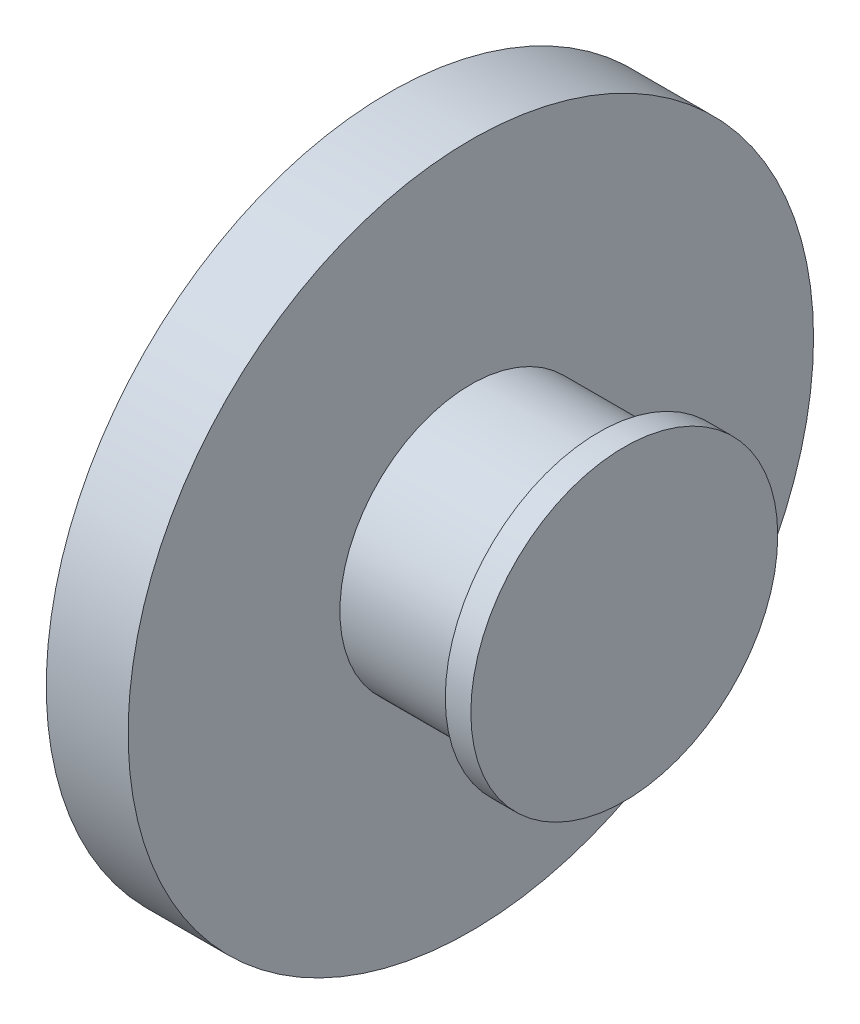
ISO-10303-21;
HEADER;
FILE_DESCRIPTION(('STEP AP214'),'2;1');
FILE_NAME('part.step','',(''),(''),'','','');
FILE_SCHEMA(('AUTOMOTIVE_DESIGN { 1 0 10303 214 1 1 1 1 }'));
ENDSEC;
DATA;
#1=APPLICATION_CONTEXT('core data for automotive mechanical design processes');
#2=APPLICATION_PROTOCOL_DEFINITION('international standard','automotive_design',2000,#1);
#3=PRODUCT_CONTEXT('',#1,'mechanical');
#4=PRODUCT('Part','Part','',(#3));
#5=PRODUCT_RELATED_PRODUCT_CATEGORY('part','',(#4));
#6=PRODUCT_DEFINITION_FORMATION('','',#4);
#7=PRODUCT_DEFINITION_CONTEXT('part definition',#1,'design');
#8=PRODUCT_DEFINITION('design','',#6,#7);
#9=PRODUCT_DEFINITION_SHAPE('','',#8);
#10=(LENGTH_UNIT() NAMED_UNIT(*) SI_UNIT(.MILLI.,.METRE.));
#11=(NAMED_UNIT(*) PLANE_ANGLE_UNIT() SI_UNIT($,.RADIAN.));
#12=(NAMED_UNIT(*) SI_UNIT($,.STERADIAN.) SOLID_ANGLE_UNIT());
#13=UNCERTAINTY_MEASURE_WITH_UNIT(LENGTH_MEASURE(1.E-05),#10,'distance_accuracy_value','');
#14=(GEOMETRIC_REPRESENTATION_CONTEXT(3) GLOBAL_UNCERTAINTY_ASSIGNED_CONTEXT((#13)) GLOBAL_UNIT_ASSIGNED_CONTEXT((#10,
#11,#12)) REPRESENTATION_CONTEXT('',''));
#15=CARTESIAN_POINT('',(0.,0.,0.));
#16=DIRECTION('',(0.,0.,1.));
#17=DIRECTION('',(1.,0.,0.));
#18=AXIS2_PLACEMENT_3D('',#15,#16,#17);
#19=CARTESIAN_POINT('',(8.,0.,0.));
#20=DIRECTION('',(-1.,0.,0.));
#21=DIRECTION('',(0.,0.,1.));
#22=AXIS2_PLACEMENT_3D('',#19,#20,#21);
#23=CYLINDRICAL_SURFACE('',#22,33.5);
#24=CARTESIAN_POINT('',(8.,0.,0.));
#25=DIRECTION('',(1.,0.,0.));
#26=DIRECTION('',(0.,0.,-1.));
#27=AXIS2_PLACEMENT_3D('',#24,#25,#26);
#28=CIRCLE('',#27,33.5);
#29=CARTESIAN_POINT('',(8.,0.,-33.5));
#30=VERTEX_POINT('',#29);
#31=EDGE_CURVE('E48',#30,#30,#28,.T.);
#32=ORIENTED_EDGE('',*,*,#31,.F.);
#33=EDGE_LOOP('',(#32));
#34=FACE_BOUND('',#33,.T.);
#35=CARTESIAN_POINT('',(0.,0.,0.));
#36=DIRECTION('',(1.,0.,0.));
#37=DIRECTION('',(0.,0.,-1.));
#38=AXIS2_PLACEMENT_3D('',#35,#36,#37);
#39=CIRCLE('',#38,33.5);
#40=CARTESIAN_POINT('',(0.,0.,-33.5));
#41=VERTEX_POINT('',#40);
#42=EDGE_CURVE('E42',#41,#41,#39,.T.);
#43=ORIENTED_EDGE('',*,*,#42,.T.);
#44=EDGE_LOOP('',(#43));
#45=FACE_BOUND('',#44,.T.);
#46=ADVANCED_FACE('F39',(#34,#45),#23,.T.);
#47=CARTESIAN_POINT('',(8.,0.,0.));
#48=DIRECTION('',(1.,0.,0.));
#49=DIRECTION('',(0.,0.,-1.));
#50=AXIS2_PLACEMENT_3D('',#47,#48,#49);
#51=PLANE('',#50);
#52=CARTESIAN_POINT('',(8.,0.,0.));
#53=DIRECTION('',(1.,0.,0.));
#54=DIRECTION('',(0.,0.,-1.));
#55=AXIS2_PLACEMENT_3D('',#52,#53,#54);
#56=CIRCLE('',#55,12.8);
#57=CARTESIAN_POINT('',(8.,0.,-12.8));
#58=VERTEX_POINT('',#57);
#59=EDGE_CURVE('E11',#58,#58,#56,.T.);
#60=ORIENTED_EDGE('',*,*,#59,.F.);
#61=EDGE_LOOP('',(#60));
#62=FACE_BOUND('',#61,.T.);
#63=ORIENTED_EDGE('',*,*,#31,.T.);
#64=EDGE_LOOP('',(#63));
#65=FACE_BOUND('',#64,.T.);
#66=ADVANCED_FACE('F266',(#62,#65),#51,.T.);
#67=CARTESIAN_POINT('',(0.,0.,0.));
#68=DIRECTION('',(1.,0.,0.));
#69=DIRECTION('',(0.,0.,-1.));
#70=AXIS2_PLACEMENT_3D('',#67,#68,#69);
#71=PLANE('',#70);
#72=DIRECTION('',(0.,-0.119879149923698,0.992788491781392));
#73=VECTOR('',#72,1.);
#74=CARTESIAN_POINT('',(0.,-6.5,-6.5));
#75=LINE('',#74,#73);
#76=CARTESIAN_POINT('',(0.,-4.00000000000001,-27.2039441890706));
#77=VERTEX_POINT('',#76);
#78=CARTESIAN_POINT('',(0.,-6.5,-6.5));
#79=VERTEX_POINT('',#78);
#80=EDGE_CURVE('E172',#77,#79,#75,.T.);
#81=ORIENTED_EDGE('',*,*,#80,.F.);
#82=CARTESIAN_POINT('',(0.,0.,-26.7209444326629));
#83=DIRECTION('',(-1.,0.,0.));
#84=DIRECTION('',(0.,0.,1.));
#85=AXIS2_PLACEMENT_3D('',#82,#83,#84);
#86=CIRCLE('',#85,4.02905556733709);
#87=CARTESIAN_POINT('',(0.,4.00000000000002,-27.2039441890706));
#88=VERTEX_POINT('',#87);
#89=EDGE_CURVE('E56',#88,#77,#86,.T.);
#90=ORIENTED_EDGE('',*,*,#89,.F.);
#91=DIRECTION('',(0.,-0.119879149923698,-0.992788491781392));
#92=VECTOR('',#91,1.);
#93=CARTESIAN_POINT('',(0.,4.00000000000002,-27.2039441890706));
#94=LINE('',#93,#92);
#95=CARTESIAN_POINT('',(0.,6.5,-6.5));
#96=VERTEX_POINT('',#95);
#97=EDGE_CURVE('E210',#96,#88,#94,.T.);
#98=ORIENTED_EDGE('',*,*,#97,.F.);
#99=DIRECTION('',(0.,-0.992788491781392,-0.119879149923698));
#100=VECTOR('',#99,1.);
#101=CARTESIAN_POINT('',(0.,6.5,-6.5));
#102=LINE('',#101,#100);
#103=CARTESIAN_POINT('',(0.,27.2039441890706,-4.));
#104=VERTEX_POINT('',#103);
#105=EDGE_CURVE('E207',#104,#96,#102,.T.);
#106=ORIENTED_EDGE('',*,*,#105,.F.);
#107=CARTESIAN_POINT('',(0.,26.7209444326629,0.));
#108=DIRECTION('',(-1.,0.,0.));
#109=DIRECTION('',(0.,0.,-1.));
#110=AXIS2_PLACEMENT_3D('',#107,#108,#109);
#111=CIRCLE('',#110,4.02905556733708);
#112=CARTESIAN_POINT('',(0.,27.2039441890706,4.));
#113=VERTEX_POINT('',#112);
#114=EDGE_CURVE('E140',#113,#104,#111,.T.);
#115=ORIENTED_EDGE('',*,*,#114,.F.);
#116=DIRECTION('',(0.,0.992788491781392,-0.119879149923698));
#117=VECTOR('',#116,1.);
#118=CARTESIAN_POINT('',(0.,27.2039441890706,4.));
#119=LINE('',#118,#117);
#120=CARTESIAN_POINT('',(0.,6.5,6.5));
#121=VERTEX_POINT('',#120);
#122=EDGE_CURVE('E201',#121,#113,#119,.T.);
#123=ORIENTED_EDGE('',*,*,#122,.F.);
#124=DIRECTION('',(0.,0.119879149923698,-0.992788491781392));
#125=VECTOR('',#124,1.);
#126=CARTESIAN_POINT('',(0.,6.5,6.5));
#127=LINE('',#126,#125);
#128=CARTESIAN_POINT('',(0.,4.00000000000002,27.2039441890706));
#129=VERTEX_POINT('',#128);
#130=EDGE_CURVE('E197',#129,#121,#127,.T.);
#131=ORIENTED_EDGE('',*,*,#130,.F.);
#132=CARTESIAN_POINT('',(0.,0.,26.7209444326629));
#133=DIRECTION('',(-1.,0.,0.));
#134=DIRECTION('',(0.,0.,-1.));
#135=AXIS2_PLACEMENT_3D('',#132,#133,#134);
#136=CIRCLE('',#135,4.02905556733709);
#137=CARTESIAN_POINT('',(0.,-4.00000000000002,27.2039441890706));
#138=VERTEX_POINT('',#137);
#139=EDGE_CURVE('E193',#138,#129,#136,.T.);
#140=ORIENTED_EDGE('',*,*,#139,.F.);
#141=DIRECTION('',(0.,0.119879149923698,0.992788491781392));
#142=VECTOR('',#141,1.);
#143=CARTESIAN_POINT('',(0.,-4.00000000000002,27.2039441890706));
#144=LINE('',#143,#142);
#145=CARTESIAN_POINT('',(0.,-6.5,6.5));
#146=VERTEX_POINT('',#145);
#147=EDGE_CURVE('E189',#146,#138,#144,.T.);
#148=ORIENTED_EDGE('',*,*,#147,.F.);
#149=DIRECTION('',(0.,0.992788491781392,0.119879149923698));
#150=VECTOR('',#149,1.);
#151=CARTESIAN_POINT('',(0.,-6.5,6.5));
#152=LINE('',#151,#150);
#153=CARTESIAN_POINT('',(0.,-27.2039441890706,4.));
#154=VERTEX_POINT('',#153);
#155=EDGE_CURVE('E185',#154,#146,#152,.T.);
#156=ORIENTED_EDGE('',*,*,#155,.F.);
#157=CARTESIAN_POINT('',(0.,-26.7209444326629,0.));
#158=DIRECTION('',(-1.,0.,0.));
#159=DIRECTION('',(0.,0.,-1.));
#160=AXIS2_PLACEMENT_3D('',#157,#158,#159);
#161=CIRCLE('',#160,4.02905556733708);
#162=CARTESIAN_POINT('',(0.,-27.2039441890706,-4.));
#163=VERTEX_POINT('',#162);
#164=EDGE_CURVE('E181',#163,#154,#161,.T.);
#165=ORIENTED_EDGE('',*,*,#164,.F.);
#166=DIRECTION('',(0.,-0.992788491781392,0.119879149923698));
#167=VECTOR('',#166,1.);
#168=CARTESIAN_POINT('',(0.,-27.2039441890706,-4.));
#169=LINE('',#168,#167);
#170=EDGE_CURVE('E177',#79,#163,#169,.T.);
#171=ORIENTED_EDGE('',*,*,#170,.F.);
#172=EDGE_LOOP('',(#81,#90,#98,#106,#115,#123,#131,#140,#148,#156,#165,#171));
#173=FACE_BOUND('',#172,.T.);
#174=ORIENTED_EDGE('',*,*,#42,.F.);
#175=EDGE_LOOP('',(#174));
#176=FACE_BOUND('',#175,.T.);
#177=ADVANCED_FACE('F263',(#173,#176),#71,.F.);
#178=CARTESIAN_POINT('',(20.5,0.,0.));
#179=DIRECTION('',(-1.,0.,0.));
#180=DIRECTION('',(0.,0.,1.));
#181=AXIS2_PLACEMENT_3D('',#178,#179,#180);
#182=CYLINDRICAL_SURFACE('',#181,12.8);
#183=CARTESIAN_POINT('',(20.5,0.,0.));
#184=DIRECTION('',(1.,0.,0.));
#185=DIRECTION('',(0.,0.,-1.));
#186=AXIS2_PLACEMENT_3D('',#183,#184,#185);
#187=CIRCLE('',#186,12.8);
#188=CARTESIAN_POINT('',(20.5,0.,-12.8));
#189=VERTEX_POINT('',#188);
#190=EDGE_CURVE('E248',#189,#189,#187,.T.);
#191=ORIENTED_EDGE('',*,*,#190,.F.);
#192=EDGE_LOOP('',(#191));
#193=FACE_BOUND('',#192,.T.);
#194=ORIENTED_EDGE('',*,*,#59,.T.);
#195=EDGE_LOOP('',(#194));
#196=FACE_BOUND('',#195,.T.);
#197=ADVANCED_FACE('F265',(#193,#196),#182,.T.);
#198=CARTESIAN_POINT('',(23.,0.,0.));
#199=DIRECTION('',(-1.,0.,0.));
#200=DIRECTION('',(0.,0.,1.));
#201=AXIS2_PLACEMENT_3D('',#198,#199,#200);
#202=CYLINDRICAL_SURFACE('',#201,15.);
#203=CARTESIAN_POINT('',(23.,0.,0.));
#204=DIRECTION('',(1.,0.,0.));
#205=DIRECTION('',(0.,0.,-1.));
#206=AXIS2_PLACEMENT_3D('',#203,#204,#205);
#207=CIRCLE('',#206,15.);
#208=CARTESIAN_POINT('',(23.,0.,-15.));
#209=VERTEX_POINT('',#208);
#210=EDGE_CURVE('E244',#209,#209,#207,.T.);
#211=ORIENTED_EDGE('',*,*,#210,.F.);
#212=EDGE_LOOP('',(#211));
#213=FACE_BOUND('',#212,.T.);
#214=CARTESIAN_POINT('',(20.5,0.,0.));
#215=DIRECTION('',(1.,0.,0.));
#216=DIRECTION('',(0.,0.,-1.));
#217=AXIS2_PLACEMENT_3D('',#214,#215,#216);
#218=CIRCLE('',#217,15.);
#219=CARTESIAN_POINT('',(20.5,0.,-15.));
#220=VERTEX_POINT('',#219);
#221=EDGE_CURVE('E216',#220,#220,#218,.T.);
#222=ORIENTED_EDGE('',*,*,#221,.T.);
#223=EDGE_LOOP('',(#222));
#224=FACE_BOUND('',#223,.T.);
#225=ADVANCED_FACE('F272',(#213,#224),#202,.T.);
#226=CARTESIAN_POINT('',(23.,0.,0.));
#227=DIRECTION('',(1.,0.,0.));
#228=DIRECTION('',(0.,0.,-1.));
#229=AXIS2_PLACEMENT_3D('',#226,#227,#228);
#230=PLANE('',#229);
#231=ORIENTED_EDGE('',*,*,#210,.T.);
#232=EDGE_LOOP('',(#231));
#233=FACE_BOUND('',#232,.T.);
#234=ADVANCED_FACE('F302',(#233),#230,.T.);
#235=CARTESIAN_POINT('',(20.5,0.,0.));
#236=DIRECTION('',(1.,0.,0.));
#237=DIRECTION('',(0.,0.,-1.));
#238=AXIS2_PLACEMENT_3D('',#235,#236,#237);
#239=PLANE('',#238);
#240=ORIENTED_EDGE('',*,*,#190,.T.);
#241=EDGE_LOOP('',(#240));
#242=FACE_BOUND('',#241,.T.);
#243=ORIENTED_EDGE('',*,*,#221,.F.);
#244=EDGE_LOOP('',(#243));
#245=FACE_BOUND('',#244,.T.);
#246=ADVANCED_FACE('F312',(#242,#245),#239,.F.);
#247=CARTESIAN_POINT('',(5.5,0.,-26.7209444326629));
#248=DIRECTION('',(-1.,0.,0.));
#249=DIRECTION('',(0.,0.,1.));
#250=AXIS2_PLACEMENT_3D('',#247,#248,#249);
#251=CYLINDRICAL_SURFACE('',#250,4.02905556733709);
#252=ORIENTED_EDGE('',*,*,#89,.T.);
#253=DIRECTION('',(-1.,0.,0.));
#254=VECTOR('',#253,1.);
#255=CARTESIAN_POINT('',(5.5,-4.00000000000002,-27.2039441890706));
#256=LINE('',#255,#254);
#257=CARTESIAN_POINT('',(5.5,-4.00000000000002,-27.2039441890706));
#258=VERTEX_POINT('',#257);
#259=EDGE_CURVE('E104',#258,#77,#256,.T.);
#260=ORIENTED_EDGE('',*,*,#259,.F.);
#261=CARTESIAN_POINT('',(5.5,0.,-26.7209444326629));
#262=DIRECTION('',(-1.,0.,0.));
#263=DIRECTION('',(0.,0.,1.));
#264=AXIS2_PLACEMENT_3D('',#261,#262,#263);
#265=CIRCLE('',#264,4.02905556733709);
#266=CARTESIAN_POINT('',(5.5,4.00000000000002,-27.2039441890706));
#267=VERTEX_POINT('',#266);
#268=EDGE_CURVE('E213',#267,#258,#265,.T.);
#269=ORIENTED_EDGE('',*,*,#268,.F.);
#270=DIRECTION('',(-1.,0.,0.));
#271=VECTOR('',#270,1.);
#272=CARTESIAN_POINT('',(5.5,4.00000000000002,-27.2039441890706));
#273=LINE('',#272,#271);
#274=EDGE_CURVE('E64',#267,#88,#273,.T.);
#275=ORIENTED_EDGE('',*,*,#274,.T.);
#276=EDGE_LOOP('',(#252,#260,#269,#275));
#277=FACE_BOUND('',#276,.T.);
#278=ADVANCED_FACE('F321',(#277),#251,.F.);
#279=CARTESIAN_POINT('',(5.5,4.00000000000002,-27.2039441890706));
#280=DIRECTION('',(0.,0.992788491781392,-0.119879149923698));
#281=DIRECTION('',(0.,0.119879149923698,0.992788491781392));
#282=AXIS2_PLACEMENT_3D('',#279,#280,#281);
#283=PLANE('',#282);
#284=ORIENTED_EDGE('',*,*,#97,.T.);
#285=ORIENTED_EDGE('',*,*,#274,.F.);
#286=DIRECTION('',(0.,-0.119879149923698,-0.992788491781392));
#287=VECTOR('',#286,1.);
#288=CARTESIAN_POINT('',(5.5,4.00000000000002,-27.2039441890706));
#289=LINE('',#288,#287);
#290=CARTESIAN_POINT('',(5.5,6.5,-6.5));
#291=VERTEX_POINT('',#290);
#292=EDGE_CURVE('E154',#291,#267,#289,.T.);
#293=ORIENTED_EDGE('',*,*,#292,.F.);
#294=DIRECTION('',(-1.,0.,0.));
#295=VECTOR('',#294,1.);
#296=CARTESIAN_POINT('',(5.5,6.5,-6.5));
#297=LINE('',#296,#295);
#298=EDGE_CURVE('E145',#291,#96,#297,.T.);
#299=ORIENTED_EDGE('',*,*,#298,.T.);
#300=EDGE_LOOP('',(#284,#285,#293,#299));
#301=FACE_BOUND('',#300,.T.);
#302=ADVANCED_FACE('F335',(#301),#283,.F.);
#303=CARTESIAN_POINT('',(5.5,6.5,-6.5));
#304=DIRECTION('',(0.,0.119879149923698,-0.992788491781392));
#305=DIRECTION('',(0.,0.992788491781392,0.119879149923698));
#306=AXIS2_PLACEMENT_3D('',#303,#304,#305);
#307=PLANE('',#306);
#308=ORIENTED_EDGE('',*,*,#105,.T.);
#309=ORIENTED_EDGE('',*,*,#298,.F.);
#310=DIRECTION('',(0.,-0.992788491781392,-0.119879149923698));
#311=VECTOR('',#310,1.);
#312=CARTESIAN_POINT('',(5.5,6.5,-6.5));
#313=LINE('',#312,#311);
#314=CARTESIAN_POINT('',(5.5,27.2039441890706,-4.));
#315=VERTEX_POINT('',#314);
#316=EDGE_CURVE('E149',#315,#291,#313,.T.);
#317=ORIENTED_EDGE('',*,*,#316,.F.);
#318=DIRECTION('',(-1.,0.,0.));
#319=VECTOR('',#318,1.);
#320=CARTESIAN_POINT('',(5.5,27.2039441890706,-4.));
#321=LINE('',#320,#319);
#322=EDGE_CURVE('E133',#315,#104,#321,.T.);
#323=ORIENTED_EDGE('',*,*,#322,.T.);
#324=EDGE_LOOP('',(#308,#309,#317,#323));
#325=FACE_BOUND('',#324,.T.);
#326=ADVANCED_FACE('F150',(#325),#307,.F.);
#327=CARTESIAN_POINT('',(5.5,26.7209444326629,0.));
#328=DIRECTION('',(-1.,0.,0.));
#329=DIRECTION('',(0.,0.,1.));
#330=AXIS2_PLACEMENT_3D('',#327,#328,#329);
#331=CYLINDRICAL_SURFACE('',#330,4.02905556733708);
#332=ORIENTED_EDGE('',*,*,#114,.T.);
#333=ORIENTED_EDGE('',*,*,#322,.F.);
#334=CARTESIAN_POINT('',(5.5,26.7209444326629,0.));
#335=DIRECTION('',(-1.,0.,0.));
#336=DIRECTION('',(0.,0.,-1.));
#337=AXIS2_PLACEMENT_3D('',#334,#335,#336);
#338=CIRCLE('',#337,4.02905556733708);
#339=CARTESIAN_POINT('',(5.5,27.2039441890706,4.));
#340=VERTEX_POINT('',#339);
#341=EDGE_CURVE('E137',#340,#315,#338,.T.);
#342=ORIENTED_EDGE('',*,*,#341,.F.);
#343=DIRECTION('',(-1.,0.,0.));
#344=VECTOR('',#343,1.);
#345=CARTESIAN_POINT('',(5.5,27.2039441890706,4.));
#346=LINE('',#345,#344);
#347=EDGE_CURVE('E146',#340,#113,#346,.T.);
#348=ORIENTED_EDGE('',*,*,#347,.T.);
#349=EDGE_LOOP('',(#332,#333,#342,#348));
#350=FACE_BOUND('',#349,.T.);
#351=ADVANCED_FACE('F135',(#350),#331,.F.);
#352=CARTESIAN_POINT('',(5.5,27.2039441890706,4.));
#353=DIRECTION('',(0.,0.119879149923698,0.992788491781392));
#354=DIRECTION('',(0.,-0.992788491781392,0.119879149923698));
#355=AXIS2_PLACEMENT_3D('',#352,#353,#354);
#356=PLANE('',#355);
#357=ORIENTED_EDGE('',*,*,#122,.T.);
#358=ORIENTED_EDGE('',*,*,#347,.F.);
#359=DIRECTION('',(0.,0.992788491781392,-0.119879149923698));
#360=VECTOR('',#359,1.);
#361=CARTESIAN_POINT('',(5.5,27.2039441890706,4.));
#362=LINE('',#361,#360);
#363=CARTESIAN_POINT('',(5.5,6.5,6.5));
#364=VERTEX_POINT('',#363);
#365=EDGE_CURVE('E160',#364,#340,#362,.T.);
#366=ORIENTED_EDGE('',*,*,#365,.F.);
#367=DIRECTION('',(-1.,0.,0.));
#368=VECTOR('',#367,1.);
#369=CARTESIAN_POINT('',(5.5,6.5,6.5));
#370=LINE('',#369,#368);
#371=EDGE_CURVE('E221',#364,#121,#370,.T.);
#372=ORIENTED_EDGE('',*,*,#371,.T.);
#373=EDGE_LOOP('',(#357,#358,#366,#372));
#374=FACE_BOUND('',#373,.T.);
#375=ADVANCED_FACE('F360',(#374),#356,.F.);
#376=CARTESIAN_POINT('',(5.5,6.5,6.5));
#377=DIRECTION('',(0.,0.992788491781392,0.119879149923698));
#378=DIRECTION('',(0.,-0.119879149923698,0.992788491781392));
#379=AXIS2_PLACEMENT_3D('',#376,#377,#378);
#380=PLANE('',#379);
#381=ORIENTED_EDGE('',*,*,#130,.T.);
#382=ORIENTED_EDGE('',*,*,#371,.F.);
#383=DIRECTION('',(0.,0.119879149923698,-0.992788491781392));
#384=VECTOR('',#383,1.);
#385=CARTESIAN_POINT('',(5.5,6.5,6.5));
#386=LINE('',#385,#384);
#387=CARTESIAN_POINT('',(5.5,4.00000000000002,27.2039441890706));
#388=VERTEX_POINT('',#387);
#389=EDGE_CURVE('E164',#388,#364,#386,.T.);
#390=ORIENTED_EDGE('',*,*,#389,.F.);
#391=DIRECTION('',(-1.,0.,0.));
#392=VECTOR('',#391,1.);
#393=CARTESIAN_POINT('',(5.5,4.00000000000002,27.2039441890706));
#394=LINE('',#393,#392);
#395=EDGE_CURVE('E224',#388,#129,#394,.T.);
#396=ORIENTED_EDGE('',*,*,#395,.T.);
#397=EDGE_LOOP('',(#381,#382,#390,#396));
#398=FACE_BOUND('',#397,.T.);
#399=ADVANCED_FACE('F369',(#398),#380,.F.);
#400=CARTESIAN_POINT('',(5.5,0.,26.7209444326629));
#401=DIRECTION('',(-1.,0.,0.));
#402=DIRECTION('',(0.,0.,1.));
#403=AXIS2_PLACEMENT_3D('',#400,#401,#402);
#404=CYLINDRICAL_SURFACE('',#403,4.02905556733709);
#405=ORIENTED_EDGE('',*,*,#139,.T.);
#406=ORIENTED_EDGE('',*,*,#395,.F.);
#407=CARTESIAN_POINT('',(5.5,0.,26.7209444326629));
#408=DIRECTION('',(-1.,0.,0.));
#409=DIRECTION('',(0.,0.,-1.));
#410=AXIS2_PLACEMENT_3D('',#407,#408,#409);
#411=CIRCLE('',#410,4.02905556733709);
#412=CARTESIAN_POINT('',(5.5,-4.00000000000002,27.2039441890706));
#413=VERTEX_POINT('',#412);
#414=EDGE_CURVE('E503',#413,#388,#411,.T.);
#415=ORIENTED_EDGE('',*,*,#414,.F.);
#416=DIRECTION('',(-1.,0.,0.));
#417=VECTOR('',#416,1.);
#418=CARTESIAN_POINT('',(5.5,-4.00000000000002,27.2039441890706));
#419=LINE('',#418,#417);
#420=EDGE_CURVE('E227',#413,#138,#419,.T.);
#421=ORIENTED_EDGE('',*,*,#420,.T.);
#422=EDGE_LOOP('',(#405,#406,#415,#421));
#423=FACE_BOUND('',#422,.T.);
#424=ADVANCED_FACE('F379',(#423),#404,.F.);
#425=CARTESIAN_POINT('',(5.5,-4.00000000000002,27.2039441890706));
#426=DIRECTION('',(0.,-0.992788491781392,0.119879149923698));
#427=DIRECTION('',(0.,-0.119879149923698,-0.992788491781392));
#428=AXIS2_PLACEMENT_3D('',#425,#426,#427);
#429=PLANE('',#428);
#430=ORIENTED_EDGE('',*,*,#147,.T.);
#431=ORIENTED_EDGE('',*,*,#420,.F.);
#432=DIRECTION('',(0.,0.119879149923698,0.992788491781392));
#433=VECTOR('',#432,1.);
#434=CARTESIAN_POINT('',(5.5,-4.00000000000002,27.2039441890706));
#435=LINE('',#434,#433);
#436=CARTESIAN_POINT('',(5.5,-6.5,6.5));
#437=VERTEX_POINT('',#436);
#438=EDGE_CURVE('E499',#437,#413,#435,.T.);
#439=ORIENTED_EDGE('',*,*,#438,.F.);
#440=DIRECTION('',(-1.,0.,0.));
#441=VECTOR('',#440,1.);
#442=CARTESIAN_POINT('',(5.5,-6.5,6.5));
#443=LINE('',#442,#441);
#444=EDGE_CURVE('E230',#437,#146,#443,.T.);
#445=ORIENTED_EDGE('',*,*,#444,.T.);
#446=EDGE_LOOP('',(#430,#431,#439,#445));
#447=FACE_BOUND('',#446,.T.);
#448=ADVANCED_FACE('F389',(#447),#429,.F.);
#449=CARTESIAN_POINT('',(5.5,-6.5,6.5));
#450=DIRECTION('',(0.,-0.119879149923698,0.992788491781392));
#451=DIRECTION('',(0.,-0.992788491781392,-0.119879149923698));
#452=AXIS2_PLACEMENT_3D('',#449,#450,#451);
#453=PLANE('',#452);
#454=ORIENTED_EDGE('',*,*,#155,.T.);
#455=ORIENTED_EDGE('',*,*,#444,.F.);
#456=DIRECTION('',(0.,0.992788491781392,0.119879149923698));
#457=VECTOR('',#456,1.);
#458=CARTESIAN_POINT('',(5.5,-6.5,6.5));
#459=LINE('',#458,#457);
#460=CARTESIAN_POINT('',(5.5,-27.2039441890706,4.));
#461=VERTEX_POINT('',#460);
#462=EDGE_CURVE('E495',#461,#437,#459,.T.);
#463=ORIENTED_EDGE('',*,*,#462,.F.);
#464=DIRECTION('',(-1.,0.,0.));
#465=VECTOR('',#464,1.);
#466=CARTESIAN_POINT('',(5.5,-27.2039441890706,4.));
#467=LINE('',#466,#465);
#468=EDGE_CURVE('E233',#461,#154,#467,.T.);
#469=ORIENTED_EDGE('',*,*,#468,.T.);
#470=EDGE_LOOP('',(#454,#455,#463,#469));
#471=FACE_BOUND('',#470,.T.);
#472=ADVANCED_FACE('F399',(#471),#453,.F.);
#473=CARTESIAN_POINT('',(5.5,-26.7209444326629,0.));
#474=DIRECTION('',(-1.,0.,0.));
#475=DIRECTION('',(0.,0.,1.));
#476=AXIS2_PLACEMENT_3D('',#473,#474,#475);
#477=CYLINDRICAL_SURFACE('',#476,4.02905556733708);
#478=ORIENTED_EDGE('',*,*,#164,.T.);
#479=ORIENTED_EDGE('',*,*,#468,.F.);
#480=CARTESIAN_POINT('',(5.5,-26.7209444326629,0.));
#481=DIRECTION('',(-1.,0.,0.));
#482=DIRECTION('',(0.,0.,-1.));
#483=AXIS2_PLACEMENT_3D('',#480,#481,#482);
#484=CIRCLE('',#483,4.02905556733708);
#485=CARTESIAN_POINT('',(5.5,-27.2039441890706,-4.));
#486=VERTEX_POINT('',#485);
#487=EDGE_CURVE('E491',#486,#461,#484,.T.);
#488=ORIENTED_EDGE('',*,*,#487,.F.);
#489=DIRECTION('',(-1.,0.,0.));
#490=VECTOR('',#489,1.);
#491=CARTESIAN_POINT('',(5.5,-27.2039441890706,-4.));
#492=LINE('',#491,#490);
#493=EDGE_CURVE('E236',#486,#163,#492,.T.);
#494=ORIENTED_EDGE('',*,*,#493,.T.);
#495=EDGE_LOOP('',(#478,#479,#488,#494));
#496=FACE_BOUND('',#495,.T.);
#497=ADVANCED_FACE('F409',(#496),#477,.F.);
#498=CARTESIAN_POINT('',(5.5,-27.2039441890706,-4.));
#499=DIRECTION('',(0.,-0.119879149923698,-0.992788491781392));
#500=DIRECTION('',(0.,0.992788491781392,-0.119879149923698));
#501=AXIS2_PLACEMENT_3D('',#498,#499,#500);
#502=PLANE('',#501);
#503=ORIENTED_EDGE('',*,*,#170,.T.);
#504=ORIENTED_EDGE('',*,*,#493,.F.);
#505=DIRECTION('',(0.,-0.992788491781392,0.119879149923698));
#506=VECTOR('',#505,1.);
#507=CARTESIAN_POINT('',(5.5,-27.2039441890706,-4.));
#508=LINE('',#507,#506);
#509=CARTESIAN_POINT('',(5.5,-6.5,-6.5));
#510=VERTEX_POINT('',#509);
#511=EDGE_CURVE('E487',#510,#486,#508,.T.);
#512=ORIENTED_EDGE('',*,*,#511,.F.);
#513=DIRECTION('',(-1.,0.,0.));
#514=VECTOR('',#513,1.);
#515=CARTESIAN_POINT('',(5.5,-6.5,-6.5));
#516=LINE('',#515,#514);
#517=EDGE_CURVE('E239',#510,#79,#516,.T.);
#518=ORIENTED_EDGE('',*,*,#517,.T.);
#519=EDGE_LOOP('',(#503,#504,#512,#518));
#520=FACE_BOUND('',#519,.T.);
#521=ADVANCED_FACE('F419',(#520),#502,.F.);
#522=CARTESIAN_POINT('',(5.5,-6.5,-6.5));
#523=DIRECTION('',(0.,-0.992788491781392,-0.119879149923698));
#524=DIRECTION('',(0.,0.119879149923698,-0.992788491781392));
#525=AXIS2_PLACEMENT_3D('',#522,#523,#524);
#526=PLANE('',#525);
#527=ORIENTED_EDGE('',*,*,#80,.T.);
#528=ORIENTED_EDGE('',*,*,#517,.F.);
#529=DIRECTION('',(0.,-0.119879149923698,0.992788491781392));
#530=VECTOR('',#529,1.);
#531=CARTESIAN_POINT('',(5.5,-6.5,-6.5));
#532=LINE('',#531,#530);
#533=EDGE_CURVE('E483',#258,#510,#532,.T.);
#534=ORIENTED_EDGE('',*,*,#533,.F.);
#535=ORIENTED_EDGE('',*,*,#259,.T.);
#536=EDGE_LOOP('',(#527,#528,#534,#535));
#537=FACE_BOUND('',#536,.T.);
#538=ADVANCED_FACE('F429',(#537),#526,.F.);
#539=CARTESIAN_POINT('',(5.5,0.,-26.7209444326629));
#540=DIRECTION('',(-1.,0.,0.));
#541=DIRECTION('',(0.,0.,1.));
#542=AXIS2_PLACEMENT_3D('',#539,#540,#541);
#543=PLANE('',#542);
#544=CARTESIAN_POINT('',(5.5,0.,0.));
#545=DIRECTION('',(-1.,0.,0.));
#546=DIRECTION('',(0.,0.,1.));
#547=AXIS2_PLACEMENT_3D('',#544,#545,#546);
#548=CIRCLE('',#547,6.);
#549=CARTESIAN_POINT('',(5.5,0.,6.));
#550=VERTEX_POINT('',#549);
#551=EDGE_CURVE('E475',#550,#550,#548,.T.);
#552=ORIENTED_EDGE('',*,*,#551,.F.);
#553=EDGE_LOOP('',(#552));
#554=FACE_BOUND('',#553,.T.);
#555=ORIENTED_EDGE('',*,*,#268,.T.);
#556=ORIENTED_EDGE('',*,*,#533,.T.);
#557=ORIENTED_EDGE('',*,*,#511,.T.);
#558=ORIENTED_EDGE('',*,*,#487,.T.);
#559=ORIENTED_EDGE('',*,*,#462,.T.);
#560=ORIENTED_EDGE('',*,*,#438,.T.);
#561=ORIENTED_EDGE('',*,*,#414,.T.);
#562=ORIENTED_EDGE('',*,*,#389,.T.);
#563=ORIENTED_EDGE('',*,*,#365,.T.);
#564=ORIENTED_EDGE('',*,*,#341,.T.);
#565=ORIENTED_EDGE('',*,*,#316,.T.);
#566=ORIENTED_EDGE('',*,*,#292,.T.);
#567=EDGE_LOOP('',(#555,#556,#557,#558,#559,#560,#561,#562,#563,#564,#565,#566));
#568=FACE_BOUND('',#567,.T.);
#569=ADVANCED_FACE('F157',(#554,#568),#543,.T.);
#570=CARTESIAN_POINT('',(8.7,0.,0.));
#571=DIRECTION('',(-1.,0.,0.));
#572=DIRECTION('',(0.,0.,1.));
#573=AXIS2_PLACEMENT_3D('',#570,#571,#572);
#574=CYLINDRICAL_SURFACE('',#573,6.);
#575=CARTESIAN_POINT('',(8.7,0.,0.));
#576=DIRECTION('',(-1.,0.,0.));
#577=DIRECTION('',(0.,0.,1.));
#578=AXIS2_PLACEMENT_3D('',#575,#576,#577);
#579=CIRCLE('',#578,6.);
#580=CARTESIAN_POINT('',(8.7,0.,6.));
#581=VERTEX_POINT('',#580);
#582=EDGE_CURVE('E173',#581,#581,#579,.T.);
#583=ORIENTED_EDGE('',*,*,#582,.F.);
#584=EDGE_LOOP('',(#583));
#585=FACE_BOUND('',#584,.T.);
#586=ORIENTED_EDGE('',*,*,#551,.T.);
#587=EDGE_LOOP('',(#586));
#588=FACE_BOUND('',#587,.T.);
#589=ADVANCED_FACE('F448',(#585,#588),#574,.F.);
#590=CARTESIAN_POINT('',(8.7,0.,0.));
#591=DIRECTION('',(-1.,0.,0.));
#592=DIRECTION('',(0.,0.,1.));
#593=AXIS2_PLACEMENT_3D('',#590,#591,#592);
#594=PLANE('',#593);
#595=ORIENTED_EDGE('',*,*,#582,.T.);
#596=EDGE_LOOP('',(#595));
#597=FACE_BOUND('',#596,.T.);
#598=ADVANCED_FACE('F458',(#597),#594,.T.);
#599=CLOSED_SHELL('',(#46,#66,#177,#197,#225,#234,#246,#278,#302,#326,#351,#375,#399,#424,#448,
#472,#497,#521,#538,#569,#589,#598));
#600=MANIFOLD_SOLID_BREP('B2',#599);
#601=ADVANCED_BREP_SHAPE_REPRESENTATION('',(#18,#600),#14);
#602=SHAPE_DEFINITION_REPRESENTATION(#9,#601);
ENDSEC;
END-ISO-10303-21;
